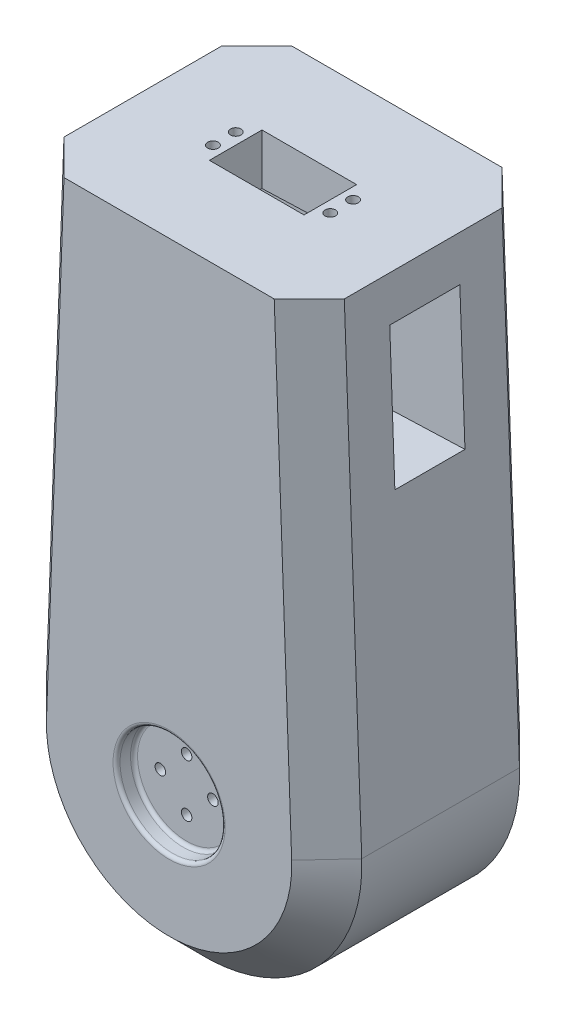
ISO-10303-21;
HEADER;
FILE_DESCRIPTION(('STEP AP214'),'2;1');
FILE_NAME('part.step','',(''),(''),'','','');
FILE_SCHEMA(('AUTOMOTIVE_DESIGN { 1 0 10303 214 1 1 1 1 }'));
ENDSEC;
DATA;
#1=APPLICATION_CONTEXT('core data for automotive mechanical design processes');
#2=APPLICATION_PROTOCOL_DEFINITION('international standard','automotive_design',2000,#1);
#3=PRODUCT_CONTEXT('',#1,'mechanical');
#4=PRODUCT('Part','Part','',(#3));
#5=PRODUCT_RELATED_PRODUCT_CATEGORY('part','',(#4));
#6=PRODUCT_DEFINITION_FORMATION('','',#4);
#7=PRODUCT_DEFINITION_CONTEXT('part definition',#1,'design');
#8=PRODUCT_DEFINITION('design','',#6,#7);
#9=PRODUCT_DEFINITION_SHAPE('','',#8);
#10=(LENGTH_UNIT() NAMED_UNIT(*) SI_UNIT(.MILLI.,.METRE.));
#11=(NAMED_UNIT(*) PLANE_ANGLE_UNIT() SI_UNIT($,.RADIAN.));
#12=(NAMED_UNIT(*) SI_UNIT($,.STERADIAN.) SOLID_ANGLE_UNIT());
#13=UNCERTAINTY_MEASURE_WITH_UNIT(LENGTH_MEASURE(1.E-05),#10,'distance_accuracy_value','');
#14=(GEOMETRIC_REPRESENTATION_CONTEXT(3) GLOBAL_UNCERTAINTY_ASSIGNED_CONTEXT((#13)) GLOBAL_UNIT_ASSIGNED_CONTEXT((#10,
#11,#12)) REPRESENTATION_CONTEXT('',''));
#15=CARTESIAN_POINT('',(0.,0.,0.));
#16=DIRECTION('',(0.,0.,1.));
#17=DIRECTION('',(1.,0.,0.));
#18=AXIS2_PLACEMENT_3D('',#15,#16,#17);
#19=CARTESIAN_POINT('',(0.,0.,65.));
#20=DIRECTION('',(0.,0.,-1.));
#21=DIRECTION('',(-1.,0.,0.));
#22=AXIS2_PLACEMENT_3D('',#19,#20,#21);
#23=CYLINDRICAL_SURFACE('',#22,45.);
#24=DIRECTION('',(0.,0.,-1.));
#25=VECTOR('',#24,1.);
#26=CARTESIAN_POINT('',(-44.9699188146276,1.64511452665381,65.));
#27=LINE('',#26,#25);
#28=CARTESIAN_POINT('',(-44.9699188146276,1.64511452665381,55.));
#29=VERTEX_POINT('',#28);
#30=CARTESIAN_POINT('',(-44.9699188146276,1.64511452665381,10.));
#31=VERTEX_POINT('',#30);
#32=EDGE_CURVE('E231',#29,#31,#27,.T.);
#33=ORIENTED_EDGE('',*,*,#32,.T.);
#34=CARTESIAN_POINT('',(0.,0.,10.));
#35=DIRECTION('',(0.,0.,1.));
#36=DIRECTION('',(1.,0.,0.));
#37=AXIS2_PLACEMENT_3D('',#34,#35,#36);
#38=CIRCLE('',#37,45.);
#39=CARTESIAN_POINT('',(44.9699188146276,1.64511452665381,10.));
#40=VERTEX_POINT('',#39);
#41=EDGE_CURVE('E268',#31,#40,#38,.T.);
#42=ORIENTED_EDGE('',*,*,#41,.T.);
#43=DIRECTION('',(0.,0.,-1.));
#44=VECTOR('',#43,1.);
#45=CARTESIAN_POINT('',(44.9699188146276,1.64511452665381,65.));
#46=LINE('',#45,#44);
#47=CARTESIAN_POINT('',(44.9699188146276,1.64511452665381,55.));
#48=VERTEX_POINT('',#47);
#49=EDGE_CURVE('E244',#48,#40,#46,.T.);
#50=ORIENTED_EDGE('',*,*,#49,.F.);
#51=CARTESIAN_POINT('',(0.,0.,55.));
#52=DIRECTION('',(0.,0.,1.));
#53=DIRECTION('',(1.,0.,0.));
#54=AXIS2_PLACEMENT_3D('',#51,#52,#53);
#55=CIRCLE('',#54,45.);
#56=EDGE_CURVE('E266',#48,#29,#55,.F.);
#57=ORIENTED_EDGE('',*,*,#56,.T.);
#58=EDGE_LOOP('',(#33,#42,#50,#57));
#59=FACE_BOUND('',#58,.T.);
#60=ADVANCED_FACE('F39',(#59),#23,.T.);
#61=CARTESIAN_POINT('',(40.,137.5,65.));
#62=DIRECTION('',(-0.999331529213945,-0.0365581005923068,0.));
#63=DIRECTION('',(0.0365581005923068,-0.999331529213946,0.));
#64=AXIS2_PLACEMENT_3D('',#61,#62,#63);
#65=PLANE('',#64);
#66=DIRECTION('',(0.,0.,1.));
#67=VECTOR('',#66,1.);
#68=CARTESIAN_POINT('',(40.4569762574038,125.008355884826,42.5));
#69=LINE('',#68,#67);
#70=CARTESIAN_POINT('',(40.4569762574038,125.008355884826,22.5));
#71=VERTEX_POINT('',#70);
#72=CARTESIAN_POINT('',(40.4569762574038,125.008355884826,42.5));
#73=VERTEX_POINT('',#72);
#74=EDGE_CURVE('E185',#71,#73,#69,.T.);
#75=ORIENTED_EDGE('',*,*,#74,.F.);
#76=DIRECTION('',(-0.0365581005923069,0.999331529213945,0.));
#77=VECTOR('',#76,1.);
#78=CARTESIAN_POINT('',(40.4569762574038,125.008355884826,22.5));
#79=LINE('',#78,#77);
#80=CARTESIAN_POINT('',(41.9193002810961,85.0350947162679,22.5));
#81=VERTEX_POINT('',#80);
#82=EDGE_CURVE('E182',#81,#71,#79,.T.);
#83=ORIENTED_EDGE('',*,*,#82,.F.);
#84=DIRECTION('',(0.,0.,-1.));
#85=VECTOR('',#84,1.);
#86=CARTESIAN_POINT('',(41.9193002810961,85.0350947162679,42.5));
#87=LINE('',#86,#85);
#88=CARTESIAN_POINT('',(41.9193002810961,85.0350947162679,42.5));
#89=VERTEX_POINT('',#88);
#90=EDGE_CURVE('E191',#89,#81,#87,.T.);
#91=ORIENTED_EDGE('',*,*,#90,.F.);
#92=DIRECTION('',(0.0365581005923069,-0.999331529213945,0.));
#93=VECTOR('',#92,1.);
#94=CARTESIAN_POINT('',(40.4569762574038,125.008355884826,42.5));
#95=LINE('',#94,#93);
#96=EDGE_CURVE('E188',#73,#89,#95,.T.);
#97=ORIENTED_EDGE('',*,*,#96,.F.);
#98=EDGE_LOOP('',(#75,#83,#91,#97));
#99=FACE_BOUND('',#98,.T.);
#100=ORIENTED_EDGE('',*,*,#49,.T.);
#101=DIRECTION('',(-0.0365581005923068,0.999331529213946,0.));
#102=VECTOR('',#101,1.);
#103=CARTESIAN_POINT('',(40.,137.5,10.));
#104=LINE('',#103,#102);
#105=CARTESIAN_POINT('',(40.,137.5,10.));
#106=VERTEX_POINT('',#105);
#107=EDGE_CURVE('E272',#40,#106,#104,.T.);
#108=ORIENTED_EDGE('',*,*,#107,.T.);
#109=DIRECTION('',(0.,0.,-1.));
#110=VECTOR('',#109,1.);
#111=CARTESIAN_POINT('',(40.,137.5,65.));
#112=LINE('',#111,#110);
#113=CARTESIAN_POINT('',(40.,137.5,55.));
#114=VERTEX_POINT('',#113);
#115=EDGE_CURVE('E241',#114,#106,#112,.T.);
#116=ORIENTED_EDGE('',*,*,#115,.F.);
#117=DIRECTION('',(0.0365581005923068,-0.999331529213946,0.));
#118=VECTOR('',#117,1.);
#119=CARTESIAN_POINT('',(44.9699188146276,1.64511452665381,55.));
#120=LINE('',#119,#118);
#121=EDGE_CURVE('E270',#114,#48,#120,.T.);
#122=ORIENTED_EDGE('',*,*,#121,.T.);
#123=EDGE_LOOP('',(#100,#108,#116,#122));
#124=FACE_BOUND('',#123,.T.);
#125=ADVANCED_FACE('F322',(#99,#124),#65,.F.);
#126=CARTESIAN_POINT('',(-40.,137.5,65.));
#127=DIRECTION('',(0.,-1.,0.));
#128=DIRECTION('',(0.,0.,-1.));
#129=AXIS2_PLACEMENT_3D('',#126,#127,#128);
#130=PLANE('',#129);
#131=CARTESIAN_POINT('',(16.7499999999999,137.5,29.25));
#132=DIRECTION('',(0.,1.,0.));
#133=DIRECTION('',(0.,0.,-1.));
#134=AXIS2_PLACEMENT_3D('',#131,#132,#133);
#135=CIRCLE('',#134,1.50000000000001);
#136=CARTESIAN_POINT('',(16.7499999999999,137.5,27.75));
#137=VERTEX_POINT('',#136);
#138=EDGE_CURVE('E457',#137,#137,#135,.T.);
#139=ORIENTED_EDGE('',*,*,#138,.F.);
#140=EDGE_LOOP('',(#139));
#141=FACE_BOUND('',#140,.T.);
#142=CARTESIAN_POINT('',(16.75,137.5,35.75));
#143=DIRECTION('',(0.,1.,0.));
#144=DIRECTION('',(0.,0.,1.));
#145=AXIS2_PLACEMENT_3D('',#142,#143,#144);
#146=CIRCLE('',#145,1.5);
#147=CARTESIAN_POINT('',(16.75,137.5,37.25));
#148=VERTEX_POINT('',#147);
#149=EDGE_CURVE('E461',#148,#148,#146,.T.);
#150=ORIENTED_EDGE('',*,*,#149,.F.);
#151=EDGE_LOOP('',(#150));
#152=FACE_BOUND('',#151,.T.);
#153=CARTESIAN_POINT('',(-16.75,137.5,35.75));
#154=DIRECTION('',(0.,1.,0.));
#155=DIRECTION('',(0.,0.,-1.));
#156=AXIS2_PLACEMENT_3D('',#153,#154,#155);
#157=CIRCLE('',#156,1.5);
#158=CARTESIAN_POINT('',(-16.75,137.5,34.25));
#159=VERTEX_POINT('',#158);
#160=EDGE_CURVE('E465',#159,#159,#157,.T.);
#161=ORIENTED_EDGE('',*,*,#160,.F.);
#162=EDGE_LOOP('',(#161));
#163=FACE_BOUND('',#162,.T.);
#164=CARTESIAN_POINT('',(-16.75,137.5,29.25));
#165=DIRECTION('',(0.,1.,0.));
#166=DIRECTION('',(0.,0.,1.));
#167=AXIS2_PLACEMENT_3D('',#164,#165,#166);
#168=CIRCLE('',#167,1.5);
#169=CARTESIAN_POINT('',(-16.75,137.5,30.75));
#170=VERTEX_POINT('',#169);
#171=EDGE_CURVE('E468',#170,#170,#168,.T.);
#172=ORIENTED_EDGE('',*,*,#171,.F.);
#173=EDGE_LOOP('',(#172));
#174=FACE_BOUND('',#173,.T.);
#175=DIRECTION('',(-1.,0.,0.));
#176=VECTOR('',#175,1.);
#177=CARTESIAN_POINT('',(-13.5,137.5,25.));
#178=LINE('',#177,#176);
#179=CARTESIAN_POINT('',(13.5,137.5,25.));
#180=VERTEX_POINT('',#179);
#181=CARTESIAN_POINT('',(-13.5,137.5,25.));
#182=VERTEX_POINT('',#181);
#183=EDGE_CURVE('E164',#180,#182,#178,.T.);
#184=ORIENTED_EDGE('',*,*,#183,.F.);
#185=DIRECTION('',(0.,0.,-1.));
#186=VECTOR('',#185,1.);
#187=CARTESIAN_POINT('',(13.5,137.5,25.));
#188=LINE('',#187,#186);
#189=CARTESIAN_POINT('',(13.5,137.5,40.));
#190=VERTEX_POINT('',#189);
#191=EDGE_CURVE('E54',#190,#180,#188,.T.);
#192=ORIENTED_EDGE('',*,*,#191,.F.);
#193=DIRECTION('',(1.,0.,0.));
#194=VECTOR('',#193,1.);
#195=CARTESIAN_POINT('',(-13.5,137.5,40.));
#196=LINE('',#195,#194);
#197=CARTESIAN_POINT('',(-13.5,137.5,40.));
#198=VERTEX_POINT('',#197);
#199=EDGE_CURVE('E171',#198,#190,#196,.T.);
#200=ORIENTED_EDGE('',*,*,#199,.F.);
#201=DIRECTION('',(0.,0.,1.));
#202=VECTOR('',#201,1.);
#203=CARTESIAN_POINT('',(-13.5,137.5,25.));
#204=LINE('',#203,#202);
#205=EDGE_CURVE('E155',#182,#198,#204,.T.);
#206=ORIENTED_EDGE('',*,*,#205,.F.);
#207=EDGE_LOOP('',(#184,#192,#200,#206));
#208=FACE_BOUND('',#207,.T.);
#209=DIRECTION('',(-1.,0.,0.));
#210=VECTOR('',#209,1.);
#211=CARTESIAN_POINT('',(-40.,137.5,0.));
#212=LINE('',#211,#210);
#213=CARTESIAN_POINT('',(29.9933108206184,137.5,0.));
#214=VERTEX_POINT('',#213);
#215=CARTESIAN_POINT('',(-29.9933108206184,137.5,0.));
#216=VERTEX_POINT('',#215);
#217=EDGE_CURVE('E232',#214,#216,#212,.T.);
#218=ORIENTED_EDGE('',*,*,#217,.T.);
#219=DIRECTION('',(0.70734316078287,0.,-0.70687032254417));
#220=VECTOR('',#219,1.);
#221=CARTESIAN_POINT('',(-40.,137.5,10.));
#222=LINE('',#221,#220);
#223=CARTESIAN_POINT('',(-40.,137.5,10.));
#224=VERTEX_POINT('',#223);
#225=EDGE_CURVE('E264',#216,#224,#222,.F.);
#226=ORIENTED_EDGE('',*,*,#225,.T.);
#227=DIRECTION('',(0.,0.,-1.));
#228=VECTOR('',#227,1.);
#229=CARTESIAN_POINT('',(-40.,137.5,65.));
#230=LINE('',#229,#228);
#231=CARTESIAN_POINT('',(-40.,137.5,55.));
#232=VERTEX_POINT('',#231);
#233=EDGE_CURVE('E238',#232,#224,#230,.T.);
#234=ORIENTED_EDGE('',*,*,#233,.F.);
#235=DIRECTION('',(0.70734316078287,0.,0.70687032254417));
#236=VECTOR('',#235,1.);
#237=CARTESIAN_POINT('',(-32.486623321048,137.5,62.5083542061375));
#238=LINE('',#237,#236);
#239=CARTESIAN_POINT('',(-29.9933108206184,137.5,65.));
#240=VERTEX_POINT('',#239);
#241=EDGE_CURVE('E260',#232,#240,#238,.T.);
#242=ORIENTED_EDGE('',*,*,#241,.T.);
#243=DIRECTION('',(-1.,0.,0.));
#244=VECTOR('',#243,1.);
#245=CARTESIAN_POINT('',(-40.,137.5,65.));
#246=LINE('',#245,#244);
#247=CARTESIAN_POINT('',(29.9933108206184,137.5,65.));
#248=VERTEX_POINT('',#247);
#249=EDGE_CURVE('E228',#248,#240,#246,.T.);
#250=ORIENTED_EDGE('',*,*,#249,.F.);
#251=DIRECTION('',(0.70734316078287,0.,-0.70687032254417));
#252=VECTOR('',#251,1.);
#253=CARTESIAN_POINT('',(32.486623321048,137.5,62.5083542061375));
#254=LINE('',#253,#252);
#255=EDGE_CURVE('E258',#248,#114,#254,.T.);
#256=ORIENTED_EDGE('',*,*,#255,.T.);
#257=ORIENTED_EDGE('',*,*,#115,.T.);
#258=DIRECTION('',(0.70734316078287,0.,0.70687032254417));
#259=VECTOR('',#258,1.);
#260=CARTESIAN_POINT('',(40.,137.5,10.));
#261=LINE('',#260,#259);
#262=EDGE_CURVE('E262',#106,#214,#261,.F.);
#263=ORIENTED_EDGE('',*,*,#262,.T.);
#264=EDGE_LOOP('',(#218,#226,#234,#242,#250,#256,#257,#263));
#265=FACE_BOUND('',#264,.T.);
#266=ADVANCED_FACE('F168',(#141,#152,#163,#174,#208,#265),#130,.F.);
#267=CARTESIAN_POINT('',(-40.,137.5,65.));
#268=DIRECTION('',(0.999331529213945,-0.0365581005923068,0.));
#269=DIRECTION('',(0.0365581005923068,0.999331529213946,0.));
#270=AXIS2_PLACEMENT_3D('',#267,#268,#269);
#271=PLANE('',#270);
#272=DIRECTION('',(0.,0.,-1.));
#273=VECTOR('',#272,1.);
#274=CARTESIAN_POINT('',(-42.0316504387737,81.9639544474815,65.));
#275=LINE('',#274,#273);
#276=CARTESIAN_POINT('',(-42.0316504387737,81.9639544474815,42.5));
#277=VERTEX_POINT('',#276);
#278=CARTESIAN_POINT('',(-42.0316504387737,81.9639544474815,22.5));
#279=VERTEX_POINT('',#278);
#280=EDGE_CURVE('E47',#277,#279,#275,.T.);
#281=ORIENTED_EDGE('',*,*,#280,.T.);
#282=DIRECTION('',(0.0365581005923068,0.999331529213946,0.));
#283=VECTOR('',#282,1.);
#284=CARTESIAN_POINT('',(-40.,137.5,22.5));
#285=LINE('',#284,#283);
#286=CARTESIAN_POINT('',(-40.5654071622901,122.044350090257,22.5));
#287=VERTEX_POINT('',#286);
#288=EDGE_CURVE('E11',#279,#287,#285,.T.);
#289=ORIENTED_EDGE('',*,*,#288,.T.);
#290=DIRECTION('',(0.,0.,1.));
#291=VECTOR('',#290,1.);
#292=CARTESIAN_POINT('',(-40.5654071622901,122.044350090257,65.));
#293=LINE('',#292,#291);
#294=CARTESIAN_POINT('',(-40.5654071622901,122.044350090257,42.5));
#295=VERTEX_POINT('',#294);
#296=EDGE_CURVE('E301',#287,#295,#293,.T.);
#297=ORIENTED_EDGE('',*,*,#296,.T.);
#298=DIRECTION('',(-0.0365581005923068,-0.999331529213946,0.));
#299=VECTOR('',#298,1.);
#300=CARTESIAN_POINT('',(-40.,137.5,42.5));
#301=LINE('',#300,#299);
#302=EDGE_CURVE('E304',#295,#277,#301,.T.);
#303=ORIENTED_EDGE('',*,*,#302,.T.);
#304=EDGE_LOOP('',(#281,#289,#297,#303));
#305=FACE_BOUND('',#304,.T.);
#306=ORIENTED_EDGE('',*,*,#233,.T.);
#307=DIRECTION('',(-0.0365581005923068,-0.999331529213946,0.));
#308=VECTOR('',#307,1.);
#309=CARTESIAN_POINT('',(-40.,137.5,10.));
#310=LINE('',#309,#308);
#311=EDGE_CURVE('E249',#224,#31,#310,.T.);
#312=ORIENTED_EDGE('',*,*,#311,.T.);
#313=ORIENTED_EDGE('',*,*,#32,.F.);
#314=DIRECTION('',(0.0365581005923068,0.999331529213946,0.));
#315=VECTOR('',#314,1.);
#316=CARTESIAN_POINT('',(-40.,137.5,55.));
#317=LINE('',#316,#315);
#318=EDGE_CURVE('E247',#29,#232,#317,.T.);
#319=ORIENTED_EDGE('',*,*,#318,.T.);
#320=EDGE_LOOP('',(#306,#312,#313,#319));
#321=FACE_BOUND('',#320,.T.);
#322=ADVANCED_FACE('F308',(#305,#321),#271,.F.);
#323=CARTESIAN_POINT('',(0.,0.,65.));
#324=DIRECTION('',(0.,0.,1.));
#325=DIRECTION('',(1.,0.,0.));
#326=AXIS2_PLACEMENT_3D('',#323,#324,#325);
#327=PLANE('',#326);
#328=CARTESIAN_POINT('',(0.,0.,65.));
#329=DIRECTION('',(0.,0.,1.));
#330=DIRECTION('',(1.,0.,0.));
#331=AXIS2_PLACEMENT_3D('',#328,#329,#330);
#332=CIRCLE('',#331,16.);
#333=CARTESIAN_POINT('',(16.,0.,65.));
#334=VERTEX_POINT('',#333);
#335=EDGE_CURVE('E298',#334,#334,#332,.F.);
#336=ORIENTED_EDGE('',*,*,#335,.T.);
#337=EDGE_LOOP('',(#336));
#338=FACE_BOUND('',#337,.T.);
#339=ORIENTED_EDGE('',*,*,#249,.T.);
#340=DIRECTION('',(-0.0365581005923068,-0.999331529213946,0.));
#341=VECTOR('',#340,1.);
#342=CARTESIAN_POINT('',(-34.9766035224881,1.27953352073074,65.));
#343=LINE('',#342,#341);
#344=CARTESIAN_POINT('',(-34.976603522488,1.27953352073074,65.));
#345=VERTEX_POINT('',#344);
#346=EDGE_CURVE('E278',#240,#345,#343,.T.);
#347=ORIENTED_EDGE('',*,*,#346,.T.);
#348=CARTESIAN_POINT('',(0.,0.,65.));
#349=DIRECTION('',(0.,0.,1.));
#350=DIRECTION('',(1.,0.,0.));
#351=AXIS2_PLACEMENT_3D('',#348,#349,#350);
#352=CIRCLE('',#351,35.);
#353=CARTESIAN_POINT('',(34.9766035224881,1.27953352073074,65.));
#354=VERTEX_POINT('',#353);
#355=EDGE_CURVE('E276',#345,#354,#352,.T.);
#356=ORIENTED_EDGE('',*,*,#355,.T.);
#357=DIRECTION('',(-0.0365581005923068,0.999331529213946,0.));
#358=VECTOR('',#357,1.);
#359=CARTESIAN_POINT('',(30.0066847078605,137.134418994077,65.));
#360=LINE('',#359,#358);
#361=EDGE_CURVE('E274',#354,#248,#360,.T.);
#362=ORIENTED_EDGE('',*,*,#361,.T.);
#363=EDGE_LOOP('',(#339,#347,#356,#362));
#364=FACE_BOUND('',#363,.T.);
#365=ADVANCED_FACE('F442',(#338,#364),#327,.T.);
#366=CARTESIAN_POINT('',(0.,0.,0.));
#367=DIRECTION('',(0.,0.,1.));
#368=DIRECTION('',(1.,0.,0.));
#369=AXIS2_PLACEMENT_3D('',#366,#367,#368);
#370=PLANE('',#369);
#371=CARTESIAN_POINT('',(0.,0.,0.));
#372=DIRECTION('',(0.,0.,1.));
#373=DIRECTION('',(1.,0.,0.));
#374=AXIS2_PLACEMENT_3D('',#371,#372,#373);
#375=CIRCLE('',#374,35.);
#376=CARTESIAN_POINT('',(34.9766035224881,1.27953352073074,0.));
#377=VERTEX_POINT('',#376);
#378=CARTESIAN_POINT('',(-34.976603522488,1.27953352073074,0.));
#379=VERTEX_POINT('',#378);
#380=EDGE_CURVE('E254',#377,#379,#375,.F.);
#381=ORIENTED_EDGE('',*,*,#380,.T.);
#382=DIRECTION('',(0.0365581005923068,0.999331529213946,0.));
#383=VECTOR('',#382,1.);
#384=CARTESIAN_POINT('',(-34.9766035224881,1.27953352073074,0.));
#385=LINE('',#384,#383);
#386=EDGE_CURVE('E256',#379,#216,#385,.T.);
#387=ORIENTED_EDGE('',*,*,#386,.T.);
#388=ORIENTED_EDGE('',*,*,#217,.F.);
#389=DIRECTION('',(0.0365581005923068,-0.999331529213946,0.));
#390=VECTOR('',#389,1.);
#391=CARTESIAN_POINT('',(34.9766035224881,1.27953352073074,0.));
#392=LINE('',#391,#390);
#393=EDGE_CURVE('E252',#214,#377,#392,.T.);
#394=ORIENTED_EDGE('',*,*,#393,.T.);
#395=EDGE_LOOP('',(#381,#387,#388,#394));
#396=FACE_BOUND('',#395,.T.);
#397=ADVANCED_FACE('F374',(#396),#370,.F.);
#398=CARTESIAN_POINT('',(40.,137.5,10.));
#399=DIRECTION('',(-0.706634100960703,-0.0258504808361201,0.707106781186548));
#400=DIRECTION('',(-0.0365581005923068,0.999331529213946,0.));
#401=AXIS2_PLACEMENT_3D('',#398,#399,#400);
#402=PLANE('',#401);
#403=ORIENTED_EDGE('',*,*,#262,.F.);
#404=ORIENTED_EDGE('',*,*,#107,.F.);
#405=DIRECTION('',(0.706634100960704,0.0258504808361201,0.707106781186547));
#406=VECTOR('',#405,1.);
#407=CARTESIAN_POINT('',(34.9766035224881,1.27953352073074,0.));
#408=LINE('',#407,#406);
#409=EDGE_CURVE('E235',#377,#40,#408,.T.);
#410=ORIENTED_EDGE('',*,*,#409,.F.);
#411=ORIENTED_EDGE('',*,*,#393,.F.);
#412=EDGE_LOOP('',(#403,#404,#410,#411));
#413=FACE_BOUND('',#412,.T.);
#414=ADVANCED_FACE('F368',(#413),#402,.F.);
#415=CARTESIAN_POINT('',(0.,0.,10.));
#416=DIRECTION('',(0.,0.,1.));
#417=DIRECTION('',(1.,0.,0.));
#418=AXIS2_PLACEMENT_3D('',#415,#416,#417);
#419=CONICAL_SURFACE('',#418,45.,0.785398163397449);
#420=ORIENTED_EDGE('',*,*,#409,.T.);
#421=ORIENTED_EDGE('',*,*,#41,.F.);
#422=DIRECTION('',(-0.706634100960704,0.0258504808361201,0.707106781186547));
#423=VECTOR('',#422,1.);
#424=CARTESIAN_POINT('',(-34.976603522488,1.27953352073074,0.));
#425=LINE('',#424,#423);
#426=EDGE_CURVE('E282',#379,#31,#425,.T.);
#427=ORIENTED_EDGE('',*,*,#426,.F.);
#428=ORIENTED_EDGE('',*,*,#380,.F.);
#429=EDGE_LOOP('',(#420,#421,#427,#428));
#430=FACE_BOUND('',#429,.T.);
#431=ADVANCED_FACE('F361',(#430),#419,.T.);
#432=CARTESIAN_POINT('',(-40.,137.5,10.));
#433=DIRECTION('',(0.706634100960703,-0.0258504808361201,0.707106781186548));
#434=DIRECTION('',(-0.0365581005923068,-0.999331529213946,0.));
#435=AXIS2_PLACEMENT_3D('',#432,#433,#434);
#436=PLANE('',#435);
#437=ORIENTED_EDGE('',*,*,#225,.F.);
#438=ORIENTED_EDGE('',*,*,#386,.F.);
#439=ORIENTED_EDGE('',*,*,#426,.T.);
#440=ORIENTED_EDGE('',*,*,#311,.F.);
#441=EDGE_LOOP('',(#437,#438,#439,#440));
#442=FACE_BOUND('',#441,.T.);
#443=ADVANCED_FACE('F353',(#442),#436,.F.);
#444=CARTESIAN_POINT('',(34.9766035224881,1.27953352073074,65.));
#445=DIRECTION('',(0.706634100960703,0.0258504808361201,0.707106781186548));
#446=DIRECTION('',(0.0365581005923068,-0.999331529213946,0.));
#447=AXIS2_PLACEMENT_3D('',#444,#445,#446);
#448=PLANE('',#447);
#449=ORIENTED_EDGE('',*,*,#255,.F.);
#450=ORIENTED_EDGE('',*,*,#361,.F.);
#451=DIRECTION('',(-0.706634100960704,-0.0258504808361201,0.707106781186547));
#452=VECTOR('',#451,1.);
#453=CARTESIAN_POINT('',(44.9699188146276,1.64511452665381,55.));
#454=LINE('',#453,#452);
#455=EDGE_CURVE('E284',#48,#354,#454,.T.);
#456=ORIENTED_EDGE('',*,*,#455,.F.);
#457=ORIENTED_EDGE('',*,*,#121,.F.);
#458=EDGE_LOOP('',(#449,#450,#456,#457));
#459=FACE_BOUND('',#458,.T.);
#460=ADVANCED_FACE('F360',(#459),#448,.T.);
#461=CARTESIAN_POINT('',(0.,0.,65.));
#462=DIRECTION('',(0.,0.,-1.));
#463=DIRECTION('',(-1.,0.,0.));
#464=AXIS2_PLACEMENT_3D('',#461,#462,#463);
#465=CONICAL_SURFACE('',#464,35.,0.785398163397449);
#466=ORIENTED_EDGE('',*,*,#455,.T.);
#467=ORIENTED_EDGE('',*,*,#355,.F.);
#468=DIRECTION('',(0.706634100960704,-0.0258504808361201,0.707106781186547));
#469=VECTOR('',#468,1.);
#470=CARTESIAN_POINT('',(-44.9699188146276,1.64511452665381,55.));
#471=LINE('',#470,#469);
#472=EDGE_CURVE('E207',#29,#345,#471,.T.);
#473=ORIENTED_EDGE('',*,*,#472,.F.);
#474=ORIENTED_EDGE('',*,*,#56,.F.);
#475=EDGE_LOOP('',(#466,#467,#473,#474));
#476=FACE_BOUND('',#475,.T.);
#477=ADVANCED_FACE('F384',(#476),#465,.T.);
#478=CARTESIAN_POINT('',(-34.9766035224881,1.27953352073074,65.));
#479=DIRECTION('',(-0.706634100960703,0.0258504808361201,0.707106781186548));
#480=DIRECTION('',(0.0365581005923068,0.999331529213946,0.));
#481=AXIS2_PLACEMENT_3D('',#478,#479,#480);
#482=PLANE('',#481);
#483=ORIENTED_EDGE('',*,*,#241,.F.);
#484=ORIENTED_EDGE('',*,*,#318,.F.);
#485=ORIENTED_EDGE('',*,*,#472,.T.);
#486=ORIENTED_EDGE('',*,*,#346,.F.);
#487=EDGE_LOOP('',(#483,#484,#485,#486));
#488=FACE_BOUND('',#487,.T.);
#489=ADVANCED_FACE('F377',(#488),#482,.T.);
#490=CARTESIAN_POINT('',(0.,0.,60.));
#491=DIRECTION('',(0.,0.,1.));
#492=DIRECTION('',(1.,0.,0.));
#493=AXIS2_PLACEMENT_3D('',#490,#491,#492);
#494=CYLINDRICAL_SURFACE('',#493,15.);
#495=CARTESIAN_POINT('',(0.,0.,61.));
#496=DIRECTION('',(0.,0.,1.));
#497=DIRECTION('',(1.,0.,0.));
#498=AXIS2_PLACEMENT_3D('',#495,#496,#497);
#499=CIRCLE('',#498,15.);
#500=CARTESIAN_POINT('',(15.,0.,61.));
#501=VERTEX_POINT('',#500);
#502=EDGE_CURVE('E295',#501,#501,#499,.F.);
#503=ORIENTED_EDGE('',*,*,#502,.T.);
#504=EDGE_LOOP('',(#503));
#505=FACE_BOUND('',#504,.T.);
#506=CARTESIAN_POINT('',(0.,0.,64.));
#507=DIRECTION('',(0.,0.,1.));
#508=DIRECTION('',(1.,0.,0.));
#509=AXIS2_PLACEMENT_3D('',#506,#507,#508);
#510=CIRCLE('',#509,15.);
#511=CARTESIAN_POINT('',(15.,0.,64.));
#512=VERTEX_POINT('',#511);
#513=EDGE_CURVE('E292',#512,#512,#510,.T.);
#514=ORIENTED_EDGE('',*,*,#513,.T.);
#515=EDGE_LOOP('',(#514));
#516=FACE_BOUND('',#515,.T.);
#517=ADVANCED_FACE('F383',(#505,#516),#494,.F.);
#518=CARTESIAN_POINT('',(0.,0.,60.));
#519=DIRECTION('',(0.,0.,1.));
#520=DIRECTION('',(1.,0.,0.));
#521=AXIS2_PLACEMENT_3D('',#518,#519,#520);
#522=PLANE('',#521);
#523=CARTESIAN_POINT('',(0.,0.,60.));
#524=DIRECTION('',(0.,0.,1.));
#525=DIRECTION('',(1.,0.,0.));
#526=AXIS2_PLACEMENT_3D('',#523,#524,#525);
#527=CIRCLE('',#526,14.);
#528=CARTESIAN_POINT('',(14.,0.,60.));
#529=VERTEX_POINT('',#528);
#530=EDGE_CURVE('E281',#529,#529,#527,.T.);
#531=ORIENTED_EDGE('',*,*,#530,.T.);
#532=EDGE_LOOP('',(#531));
#533=FACE_BOUND('',#532,.T.);
#534=CARTESIAN_POINT('',(0.,7.5,60.));
#535=DIRECTION('',(0.,0.,1.));
#536=DIRECTION('',(1.,0.,0.));
#537=AXIS2_PLACEMENT_3D('',#534,#535,#536);
#538=CIRCLE('',#537,1.5);
#539=CARTESIAN_POINT('',(1.5,7.5,60.));
#540=VERTEX_POINT('',#539);
#541=EDGE_CURVE('E208',#540,#540,#538,.T.);
#542=ORIENTED_EDGE('',*,*,#541,.F.);
#543=EDGE_LOOP('',(#542));
#544=FACE_BOUND('',#543,.T.);
#545=CARTESIAN_POINT('',(7.5,0.,60.));
#546=DIRECTION('',(0.,0.,1.));
#547=DIRECTION('',(1.,0.,0.));
#548=AXIS2_PLACEMENT_3D('',#545,#546,#547);
#549=CIRCLE('',#548,1.5);
#550=CARTESIAN_POINT('',(9.,0.,60.));
#551=VERTEX_POINT('',#550);
#552=EDGE_CURVE('E211',#551,#551,#549,.T.);
#553=ORIENTED_EDGE('',*,*,#552,.F.);
#554=EDGE_LOOP('',(#553));
#555=FACE_BOUND('',#554,.T.);
#556=CARTESIAN_POINT('',(0.,-7.5,60.));
#557=DIRECTION('',(0.,0.,1.));
#558=DIRECTION('',(1.,0.,0.));
#559=AXIS2_PLACEMENT_3D('',#556,#557,#558);
#560=CIRCLE('',#559,1.5);
#561=CARTESIAN_POINT('',(1.49999999999995,-7.5,60.));
#562=VERTEX_POINT('',#561);
#563=EDGE_CURVE('E217',#562,#562,#560,.T.);
#564=ORIENTED_EDGE('',*,*,#563,.F.);
#565=EDGE_LOOP('',(#564));
#566=FACE_BOUND('',#565,.T.);
#567=CARTESIAN_POINT('',(-7.5,0.,60.));
#568=DIRECTION('',(0.,0.,1.));
#569=DIRECTION('',(1.,0.,0.));
#570=AXIS2_PLACEMENT_3D('',#567,#568,#569);
#571=CIRCLE('',#570,1.5);
#572=CARTESIAN_POINT('',(-6.,0.,60.));
#573=VERTEX_POINT('',#572);
#574=EDGE_CURVE('E223',#573,#573,#571,.T.);
#575=ORIENTED_EDGE('',*,*,#574,.F.);
#576=EDGE_LOOP('',(#575));
#577=FACE_BOUND('',#576,.T.);
#578=ADVANCED_FACE('F411',(#533,#544,#555,#566,#577),#522,.T.);
#579=CARTESIAN_POINT('',(-7.5,0.,52.5));
#580=DIRECTION('',(0.,0.,1.));
#581=DIRECTION('',(1.,0.,0.));
#582=AXIS2_PLACEMENT_3D('',#579,#580,#581);
#583=CYLINDRICAL_SURFACE('',#582,1.5);
#584=CARTESIAN_POINT('',(-7.5,0.,52.5));
#585=DIRECTION('',(0.,0.,1.));
#586=DIRECTION('',(1.,0.,0.));
#587=AXIS2_PLACEMENT_3D('',#584,#585,#586);
#588=CIRCLE('',#587,1.5);
#589=CARTESIAN_POINT('',(-6.,0.,52.5));
#590=VERTEX_POINT('',#589);
#591=EDGE_CURVE('E197',#590,#590,#588,.T.);
#592=ORIENTED_EDGE('',*,*,#591,.F.);
#593=EDGE_LOOP('',(#592));
#594=FACE_BOUND('',#593,.T.);
#595=ORIENTED_EDGE('',*,*,#574,.T.);
#596=EDGE_LOOP('',(#595));
#597=FACE_BOUND('',#596,.T.);
#598=ADVANCED_FACE('F414',(#594,#597),#583,.F.);
#599=CARTESIAN_POINT('',(-7.5,0.,52.5));
#600=DIRECTION('',(0.,0.,1.));
#601=DIRECTION('',(1.,0.,0.));
#602=AXIS2_PLACEMENT_3D('',#599,#600,#601);
#603=PLANE('',#602);
#604=ORIENTED_EDGE('',*,*,#591,.T.);
#605=EDGE_LOOP('',(#604));
#606=FACE_BOUND('',#605,.T.);
#607=ADVANCED_FACE('F425',(#606),#603,.T.);
#608=CARTESIAN_POINT('',(0.,-7.5,52.5));
#609=DIRECTION('',(0.,0.,1.));
#610=DIRECTION('',(1.,0.,0.));
#611=AXIS2_PLACEMENT_3D('',#608,#609,#610);
#612=CYLINDRICAL_SURFACE('',#611,1.5);
#613=CARTESIAN_POINT('',(0.,-7.5,52.5));
#614=DIRECTION('',(0.,0.,1.));
#615=DIRECTION('',(1.,0.,0.));
#616=AXIS2_PLACEMENT_3D('',#613,#614,#615);
#617=CIRCLE('',#616,1.5);
#618=CARTESIAN_POINT('',(1.49999999999995,-7.5,52.5));
#619=VERTEX_POINT('',#618);
#620=EDGE_CURVE('E220',#619,#619,#617,.T.);
#621=ORIENTED_EDGE('',*,*,#620,.F.);
#622=EDGE_LOOP('',(#621));
#623=FACE_BOUND('',#622,.T.);
#624=ORIENTED_EDGE('',*,*,#563,.T.);
#625=EDGE_LOOP('',(#624));
#626=FACE_BOUND('',#625,.T.);
#627=ADVANCED_FACE('F431',(#623,#626),#612,.F.);
#628=CARTESIAN_POINT('',(0.,-7.5,52.5));
#629=DIRECTION('',(0.,0.,1.));
#630=DIRECTION('',(1.,0.,0.));
#631=AXIS2_PLACEMENT_3D('',#628,#629,#630);
#632=PLANE('',#631);
#633=ORIENTED_EDGE('',*,*,#620,.T.);
#634=EDGE_LOOP('',(#633));
#635=FACE_BOUND('',#634,.T.);
#636=ADVANCED_FACE('F436',(#635),#632,.T.);
#637=CARTESIAN_POINT('',(7.5,0.,52.5));
#638=DIRECTION('',(0.,0.,1.));
#639=DIRECTION('',(1.,0.,0.));
#640=AXIS2_PLACEMENT_3D('',#637,#638,#639);
#641=CYLINDRICAL_SURFACE('',#640,1.5);
#642=CARTESIAN_POINT('',(7.5,0.,52.5));
#643=DIRECTION('',(0.,0.,1.));
#644=DIRECTION('',(1.,0.,0.));
#645=AXIS2_PLACEMENT_3D('',#642,#643,#644);
#646=CIRCLE('',#645,1.5);
#647=CARTESIAN_POINT('',(9.,0.,52.5));
#648=VERTEX_POINT('',#647);
#649=EDGE_CURVE('E214',#648,#648,#646,.T.);
#650=ORIENTED_EDGE('',*,*,#649,.F.);
#651=EDGE_LOOP('',(#650));
#652=FACE_BOUND('',#651,.T.);
#653=ORIENTED_EDGE('',*,*,#552,.T.);
#654=EDGE_LOOP('',(#653));
#655=FACE_BOUND('',#654,.T.);
#656=ADVANCED_FACE('F519',(#652,#655),#641,.F.);
#657=CARTESIAN_POINT('',(7.5,0.,52.5));
#658=DIRECTION('',(0.,0.,1.));
#659=DIRECTION('',(1.,0.,0.));
#660=AXIS2_PLACEMENT_3D('',#657,#658,#659);
#661=PLANE('',#660);
#662=ORIENTED_EDGE('',*,*,#649,.T.);
#663=EDGE_LOOP('',(#662));
#664=FACE_BOUND('',#663,.T.);
#665=ADVANCED_FACE('F517',(#664),#661,.T.);
#666=CARTESIAN_POINT('',(0.,7.5,52.5));
#667=DIRECTION('',(0.,0.,1.));
#668=DIRECTION('',(1.,0.,0.));
#669=AXIS2_PLACEMENT_3D('',#666,#667,#668);
#670=CYLINDRICAL_SURFACE('',#669,1.5);
#671=CARTESIAN_POINT('',(0.,7.5,52.5));
#672=DIRECTION('',(0.,0.,1.));
#673=DIRECTION('',(1.,0.,0.));
#674=AXIS2_PLACEMENT_3D('',#671,#672,#673);
#675=CIRCLE('',#674,1.5);
#676=CARTESIAN_POINT('',(1.5,7.5,52.5));
#677=VERTEX_POINT('',#676);
#678=EDGE_CURVE('E204',#677,#677,#675,.T.);
#679=ORIENTED_EDGE('',*,*,#678,.F.);
#680=EDGE_LOOP('',(#679));
#681=FACE_BOUND('',#680,.T.);
#682=ORIENTED_EDGE('',*,*,#541,.T.);
#683=EDGE_LOOP('',(#682));
#684=FACE_BOUND('',#683,.T.);
#685=ADVANCED_FACE('F404',(#681,#684),#670,.F.);
#686=CARTESIAN_POINT('',(0.,7.5,52.5));
#687=DIRECTION('',(0.,0.,1.));
#688=DIRECTION('',(1.,0.,0.));
#689=AXIS2_PLACEMENT_3D('',#686,#687,#688);
#690=PLANE('',#689);
#691=ORIENTED_EDGE('',*,*,#678,.T.);
#692=EDGE_LOOP('',(#691));
#693=FACE_BOUND('',#692,.T.);
#694=ADVANCED_FACE('F397',(#693),#690,.T.);
#695=CARTESIAN_POINT('',(0.,0.,61.));
#696=DIRECTION('',(0.,0.,1.));
#697=DIRECTION('',(1.,0.,0.));
#698=AXIS2_PLACEMENT_3D('',#695,#696,#697);
#699=TOROIDAL_SURFACE('',#698,14.,1.);
#700=ORIENTED_EDGE('',*,*,#502,.F.);
#701=EDGE_LOOP('',(#700));
#702=FACE_BOUND('',#701,.T.);
#703=ORIENTED_EDGE('',*,*,#530,.F.);
#704=EDGE_LOOP('',(#703));
#705=FACE_BOUND('',#704,.T.);
#706=ADVANCED_FACE('F395',(#702,#705),#699,.F.);
#707=CARTESIAN_POINT('',(0.,0.,64.));
#708=DIRECTION('',(0.,0.,1.));
#709=DIRECTION('',(1.,0.,0.));
#710=AXIS2_PLACEMENT_3D('',#707,#708,#709);
#711=TOROIDAL_SURFACE('',#710,16.,1.);
#712=ORIENTED_EDGE('',*,*,#335,.F.);
#713=EDGE_LOOP('',(#712));
#714=FACE_BOUND('',#713,.T.);
#715=ORIENTED_EDGE('',*,*,#513,.F.);
#716=EDGE_LOOP('',(#715));
#717=FACE_BOUND('',#716,.T.);
#718=ADVANCED_FACE('F41',(#714,#717),#711,.T.);
#719=CARTESIAN_POINT('',(-51.0968151105255,121.659084280168,22.5));
#720=DIRECTION('',(0.,0.,-1.));
#721=DIRECTION('',(0.,1.,0.));
#722=AXIS2_PLACEMENT_3D('',#719,#720,#721);
#723=PLANE('',#722);
#724=DIRECTION('',(0.999331529213946,0.0365581005923068,0.));
#725=VECTOR('',#724,1.);
#726=CARTESIAN_POINT('',(-49.6344910868332,81.6858231116097,22.5));
#727=LINE('',#726,#725);
#728=EDGE_CURVE('E195',#279,#81,#727,.T.);
#729=ORIENTED_EDGE('',*,*,#728,.T.);
#730=ORIENTED_EDGE('',*,*,#82,.T.);
#731=DIRECTION('',(0.999331529213946,0.0365581005923068,0.));
#732=VECTOR('',#731,1.);
#733=CARTESIAN_POINT('',(-51.0968151105255,121.659084280168,22.5));
#734=LINE('',#733,#732);
#735=EDGE_CURVE('E194',#287,#71,#734,.T.);
#736=ORIENTED_EDGE('',*,*,#735,.F.);
#737=ORIENTED_EDGE('',*,*,#288,.F.);
#738=EDGE_LOOP('',(#729,#730,#736,#737));
#739=FACE_BOUND('',#738,.T.);
#740=ADVANCED_FACE('F326',(#739),#723,.F.);
#741=CARTESIAN_POINT('',(-49.6344910868332,81.6858231116097,42.5));
#742=DIRECTION('',(0.0365581005923068,-0.999331529213946,0.));
#743=DIRECTION('',(0.999331529213946,0.0365581005923068,0.));
#744=AXIS2_PLACEMENT_3D('',#741,#742,#743);
#745=PLANE('',#744);
#746=DIRECTION('',(0.999331529213946,0.0365581005923068,0.));
#747=VECTOR('',#746,1.);
#748=CARTESIAN_POINT('',(-49.6344910868332,81.6858231116097,42.5));
#749=LINE('',#748,#747);
#750=EDGE_CURVE('E198',#277,#89,#749,.T.);
#751=ORIENTED_EDGE('',*,*,#750,.T.);
#752=ORIENTED_EDGE('',*,*,#90,.T.);
#753=ORIENTED_EDGE('',*,*,#728,.F.);
#754=ORIENTED_EDGE('',*,*,#280,.F.);
#755=EDGE_LOOP('',(#751,#752,#753,#754));
#756=FACE_BOUND('',#755,.T.);
#757=ADVANCED_FACE('F314',(#756),#745,.F.);
#758=CARTESIAN_POINT('',(-51.0968151105255,121.659084280168,42.5));
#759=DIRECTION('',(0.,0.,1.));
#760=DIRECTION('',(0.,-1.,0.));
#761=AXIS2_PLACEMENT_3D('',#758,#759,#760);
#762=PLANE('',#761);
#763=DIRECTION('',(0.999331529213946,0.0365581005923068,0.));
#764=VECTOR('',#763,1.);
#765=CARTESIAN_POINT('',(-51.0968151105255,121.659084280168,42.5));
#766=LINE('',#765,#764);
#767=EDGE_CURVE('E200',#295,#73,#766,.T.);
#768=ORIENTED_EDGE('',*,*,#767,.T.);
#769=ORIENTED_EDGE('',*,*,#96,.T.);
#770=ORIENTED_EDGE('',*,*,#750,.F.);
#771=ORIENTED_EDGE('',*,*,#302,.F.);
#772=EDGE_LOOP('',(#768,#769,#770,#771));
#773=FACE_BOUND('',#772,.T.);
#774=ADVANCED_FACE('F316',(#773),#762,.F.);
#775=CARTESIAN_POINT('',(-51.0968151105255,121.659084280168,42.5));
#776=DIRECTION('',(-0.0365581005923068,0.999331529213945,0.));
#777=DIRECTION('',(-0.999331529213946,-0.0365581005923068,0.));
#778=AXIS2_PLACEMENT_3D('',#775,#776,#777);
#779=PLANE('',#778);
#780=CARTESIAN_POINT('',(16.7499999999999,124.141094122916,29.25));
#781=DIRECTION('',(-0.0365581005923068,0.999331529213945,0.));
#782=DIRECTION('',(0.999331529213946,0.0365581005923068,0.));
#783=AXIS2_PLACEMENT_3D('',#780,#781,#782);
#784=ELLIPSE('',#783,1.50100337690724,1.50000000000001);
#785=CARTESIAN_POINT('',(18.2499999999999,124.195967955359,29.25));
#786=VERTEX_POINT('',#785);
#787=EDGE_CURVE('E483',#786,#786,#784,.F.);
#788=ORIENTED_EDGE('',*,*,#787,.F.);
#789=EDGE_LOOP('',(#788));
#790=FACE_BOUND('',#789,.T.);
#791=CARTESIAN_POINT('',(16.75,124.141094122916,35.75));
#792=DIRECTION('',(-0.0365581005923068,0.999331529213945,0.));
#793=DIRECTION('',(0.999331529213946,0.0365581005923068,0.));
#794=AXIS2_PLACEMENT_3D('',#791,#792,#793);
#795=ELLIPSE('',#794,1.50100337690723,1.5);
#796=CARTESIAN_POINT('',(18.25,124.195967955359,35.75));
#797=VERTEX_POINT('',#796);
#798=EDGE_CURVE('E479',#797,#797,#795,.F.);
#799=ORIENTED_EDGE('',*,*,#798,.F.);
#800=EDGE_LOOP('',(#799));
#801=FACE_BOUND('',#800,.T.);
#802=CARTESIAN_POINT('',(-16.75,122.915578531704,35.75));
#803=DIRECTION('',(-0.0365581005923068,0.999331529213945,0.));
#804=DIRECTION('',(0.999331529213946,0.0365581005923068,0.));
#805=AXIS2_PLACEMENT_3D('',#802,#803,#804);
#806=ELLIPSE('',#805,1.50100337690723,1.5);
#807=CARTESIAN_POINT('',(-15.25,122.970452364146,35.75));
#808=VERTEX_POINT('',#807);
#809=EDGE_CURVE('E475',#808,#808,#806,.F.);
#810=ORIENTED_EDGE('',*,*,#809,.F.);
#811=EDGE_LOOP('',(#810));
#812=FACE_BOUND('',#811,.T.);
#813=CARTESIAN_POINT('',(-16.75,122.915578531704,29.25));
#814=DIRECTION('',(-0.0365581005923068,0.999331529213945,0.));
#815=DIRECTION('',(0.999331529213946,0.0365581005923068,0.));
#816=AXIS2_PLACEMENT_3D('',#813,#814,#815);
#817=ELLIPSE('',#816,1.50100337690723,1.5);
#818=CARTESIAN_POINT('',(-15.25,122.970452364146,29.25));
#819=VERTEX_POINT('',#818);
#820=EDGE_CURVE('E470',#819,#819,#817,.F.);
#821=ORIENTED_EDGE('',*,*,#820,.F.);
#822=EDGE_LOOP('',(#821));
#823=FACE_BOUND('',#822,.T.);
#824=DIRECTION('',(-0.999331529213946,-0.0365581005923068,0.));
#825=VECTOR('',#824,1.);
#826=CARTESIAN_POINT('',(-14.6107459611033,122.993837910158,40.));
#827=LINE('',#826,#825);
#828=CARTESIAN_POINT('',(13.5,124.022200819291,40.));
#829=VERTEX_POINT('',#828);
#830=CARTESIAN_POINT('',(-13.5,123.034471835329,40.));
#831=VERTEX_POINT('',#830);
#832=EDGE_CURVE('E488',#829,#831,#827,.T.);
#833=ORIENTED_EDGE('',*,*,#832,.F.);
#834=DIRECTION('',(0.,0.,1.));
#835=VECTOR('',#834,1.);
#836=CARTESIAN_POINT('',(13.5,124.022200819291,25.));
#837=LINE('',#836,#835);
#838=CARTESIAN_POINT('',(13.5,124.022200819291,25.));
#839=VERTEX_POINT('',#838);
#840=EDGE_CURVE('E183',#839,#829,#837,.T.);
#841=ORIENTED_EDGE('',*,*,#840,.F.);
#842=DIRECTION('',(0.999331529213946,0.0365581005923068,0.));
#843=VECTOR('',#842,1.);
#844=CARTESIAN_POINT('',(-14.6107459611033,122.993837910158,25.));
#845=LINE('',#844,#843);
#846=CARTESIAN_POINT('',(-13.5,123.034471835329,25.));
#847=VERTEX_POINT('',#846);
#848=EDGE_CURVE('E180',#847,#839,#845,.T.);
#849=ORIENTED_EDGE('',*,*,#848,.F.);
#850=DIRECTION('',(0.,0.,-1.));
#851=VECTOR('',#850,1.);
#852=CARTESIAN_POINT('',(-13.5,123.034471835329,25.));
#853=LINE('',#852,#851);
#854=EDGE_CURVE('E158',#831,#847,#853,.T.);
#855=ORIENTED_EDGE('',*,*,#854,.F.);
#856=EDGE_LOOP('',(#833,#841,#849,#855));
#857=FACE_BOUND('',#856,.T.);
#858=ORIENTED_EDGE('',*,*,#735,.T.);
#859=ORIENTED_EDGE('',*,*,#74,.T.);
#860=ORIENTED_EDGE('',*,*,#767,.F.);
#861=ORIENTED_EDGE('',*,*,#296,.F.);
#862=EDGE_LOOP('',(#858,#859,#860,#861));
#863=FACE_BOUND('',#862,.T.);
#864=ADVANCED_FACE('F328',(#790,#801,#812,#823,#857,#863),#779,.F.);
#865=CARTESIAN_POINT('',(13.5,92.6311155068201,25.));
#866=DIRECTION('',(1.,0.,0.));
#867=DIRECTION('',(0.,0.,-1.));
#868=AXIS2_PLACEMENT_3D('',#865,#866,#867);
#869=PLANE('',#868);
#870=ORIENTED_EDGE('',*,*,#840,.T.);
#871=DIRECTION('',(0.,1.,0.));
#872=VECTOR('',#871,1.);
#873=CARTESIAN_POINT('',(13.5,92.6311155068201,40.));
#874=LINE('',#873,#872);
#875=EDGE_CURVE('E176',#829,#190,#874,.T.);
#876=ORIENTED_EDGE('',*,*,#875,.T.);
#877=ORIENTED_EDGE('',*,*,#191,.T.);
#878=DIRECTION('',(0.,1.,0.));
#879=VECTOR('',#878,1.);
#880=CARTESIAN_POINT('',(13.5,92.6311155068201,25.));
#881=LINE('',#880,#879);
#882=EDGE_CURVE('E161',#839,#180,#881,.T.);
#883=ORIENTED_EDGE('',*,*,#882,.F.);
#884=EDGE_LOOP('',(#870,#876,#877,#883));
#885=FACE_BOUND('',#884,.T.);
#886=ADVANCED_FACE('F330',(#885),#869,.F.);
#887=CARTESIAN_POINT('',(-13.5,92.6311155068201,40.));
#888=DIRECTION('',(0.,0.,1.));
#889=DIRECTION('',(1.,0.,0.));
#890=AXIS2_PLACEMENT_3D('',#887,#888,#889);
#891=PLANE('',#890);
#892=ORIENTED_EDGE('',*,*,#832,.T.);
#893=DIRECTION('',(0.,1.,0.));
#894=VECTOR('',#893,1.);
#895=CARTESIAN_POINT('',(-13.5,92.6311155068201,40.));
#896=LINE('',#895,#894);
#897=EDGE_CURVE('E160',#831,#198,#896,.T.);
#898=ORIENTED_EDGE('',*,*,#897,.T.);
#899=ORIENTED_EDGE('',*,*,#199,.T.);
#900=ORIENTED_EDGE('',*,*,#875,.F.);
#901=EDGE_LOOP('',(#892,#898,#899,#900));
#902=FACE_BOUND('',#901,.T.);
#903=ADVANCED_FACE('F337',(#902),#891,.F.);
#904=CARTESIAN_POINT('',(-13.5,92.6311155068201,25.));
#905=DIRECTION('',(-1.,0.,0.));
#906=DIRECTION('',(0.,0.,1.));
#907=AXIS2_PLACEMENT_3D('',#904,#905,#906);
#908=PLANE('',#907);
#909=ORIENTED_EDGE('',*,*,#854,.T.);
#910=DIRECTION('',(0.,1.,0.));
#911=VECTOR('',#910,1.);
#912=CARTESIAN_POINT('',(-13.5,92.6311155068201,25.));
#913=LINE('',#912,#911);
#914=EDGE_CURVE('E62',#847,#182,#913,.T.);
#915=ORIENTED_EDGE('',*,*,#914,.T.);
#916=ORIENTED_EDGE('',*,*,#205,.T.);
#917=ORIENTED_EDGE('',*,*,#897,.F.);
#918=EDGE_LOOP('',(#909,#915,#916,#917));
#919=FACE_BOUND('',#918,.T.);
#920=ADVANCED_FACE('F152',(#919),#908,.F.);
#921=CARTESIAN_POINT('',(-13.5,92.6311155068201,25.));
#922=DIRECTION('',(0.,0.,-1.));
#923=DIRECTION('',(-1.,0.,0.));
#924=AXIS2_PLACEMENT_3D('',#921,#922,#923);
#925=PLANE('',#924);
#926=ORIENTED_EDGE('',*,*,#848,.T.);
#927=ORIENTED_EDGE('',*,*,#882,.T.);
#928=ORIENTED_EDGE('',*,*,#183,.T.);
#929=ORIENTED_EDGE('',*,*,#914,.F.);
#930=EDGE_LOOP('',(#926,#927,#928,#929));
#931=FACE_BOUND('',#930,.T.);
#932=ADVANCED_FACE('F165',(#931),#925,.F.);
#933=CARTESIAN_POINT('',(-16.75,92.6311155068201,29.25));
#934=DIRECTION('',(0.,1.,0.));
#935=DIRECTION('',(0.,0.,1.));
#936=AXIS2_PLACEMENT_3D('',#933,#934,#935);
#937=CYLINDRICAL_SURFACE('',#936,1.5);
#938=ORIENTED_EDGE('',*,*,#820,.T.);
#939=EDGE_LOOP('',(#938));
#940=FACE_BOUND('',#939,.T.);
#941=ORIENTED_EDGE('',*,*,#171,.T.);
#942=EDGE_LOOP('',(#941));
#943=FACE_BOUND('',#942,.T.);
#944=ADVANCED_FACE('F506',(#940,#943),#937,.F.);
#945=CARTESIAN_POINT('',(-16.75,92.6311155068201,35.75));
#946=DIRECTION('',(0.,1.,0.));
#947=DIRECTION('',(0.,0.,1.));
#948=AXIS2_PLACEMENT_3D('',#945,#946,#947);
#949=CYLINDRICAL_SURFACE('',#948,1.5);
#950=ORIENTED_EDGE('',*,*,#809,.T.);
#951=EDGE_LOOP('',(#950));
#952=FACE_BOUND('',#951,.T.);
#953=ORIENTED_EDGE('',*,*,#160,.T.);
#954=EDGE_LOOP('',(#953));
#955=FACE_BOUND('',#954,.T.);
#956=ADVANCED_FACE('F665',(#952,#955),#949,.F.);
#957=CARTESIAN_POINT('',(16.75,92.6311155068201,35.75));
#958=DIRECTION('',(0.,1.,0.));
#959=DIRECTION('',(0.,0.,1.));
#960=AXIS2_PLACEMENT_3D('',#957,#958,#959);
#961=CYLINDRICAL_SURFACE('',#960,1.5);
#962=ORIENTED_EDGE('',*,*,#798,.T.);
#963=EDGE_LOOP('',(#962));
#964=FACE_BOUND('',#963,.T.);
#965=ORIENTED_EDGE('',*,*,#149,.T.);
#966=EDGE_LOOP('',(#965));
#967=FACE_BOUND('',#966,.T.);
#968=ADVANCED_FACE('F676',(#964,#967),#961,.F.);
#969=CARTESIAN_POINT('',(16.7499999999999,92.6311155068201,29.25));
#970=DIRECTION('',(0.,1.,0.));
#971=DIRECTION('',(0.,0.,1.));
#972=AXIS2_PLACEMENT_3D('',#969,#970,#971);
#973=CYLINDRICAL_SURFACE('',#972,1.50000000000001);
#974=ORIENTED_EDGE('',*,*,#787,.T.);
#975=EDGE_LOOP('',(#974));
#976=FACE_BOUND('',#975,.T.);
#977=ORIENTED_EDGE('',*,*,#138,.T.);
#978=EDGE_LOOP('',(#977));
#979=FACE_BOUND('',#978,.T.);
#980=ADVANCED_FACE('F502',(#976,#979),#973,.F.);
#981=CLOSED_SHELL('',(#60,#125,#266,#322,#365,#397,#414,#431,#443,#460,#477,#489,#517,#578,#598,
#607,#627,#636,#656,#665,#685,#694,#706,#718,#740,#757,#774,#864,#886,#903,#920,#932,#944,#956,
#968,#980));
#982=MANIFOLD_SOLID_BREP('B2',#981);
#983=ADVANCED_BREP_SHAPE_REPRESENTATION('',(#18,#982),#14);
#984=SHAPE_DEFINITION_REPRESENTATION(#9,#983);
ENDSEC;
END-ISO-10303-21;
